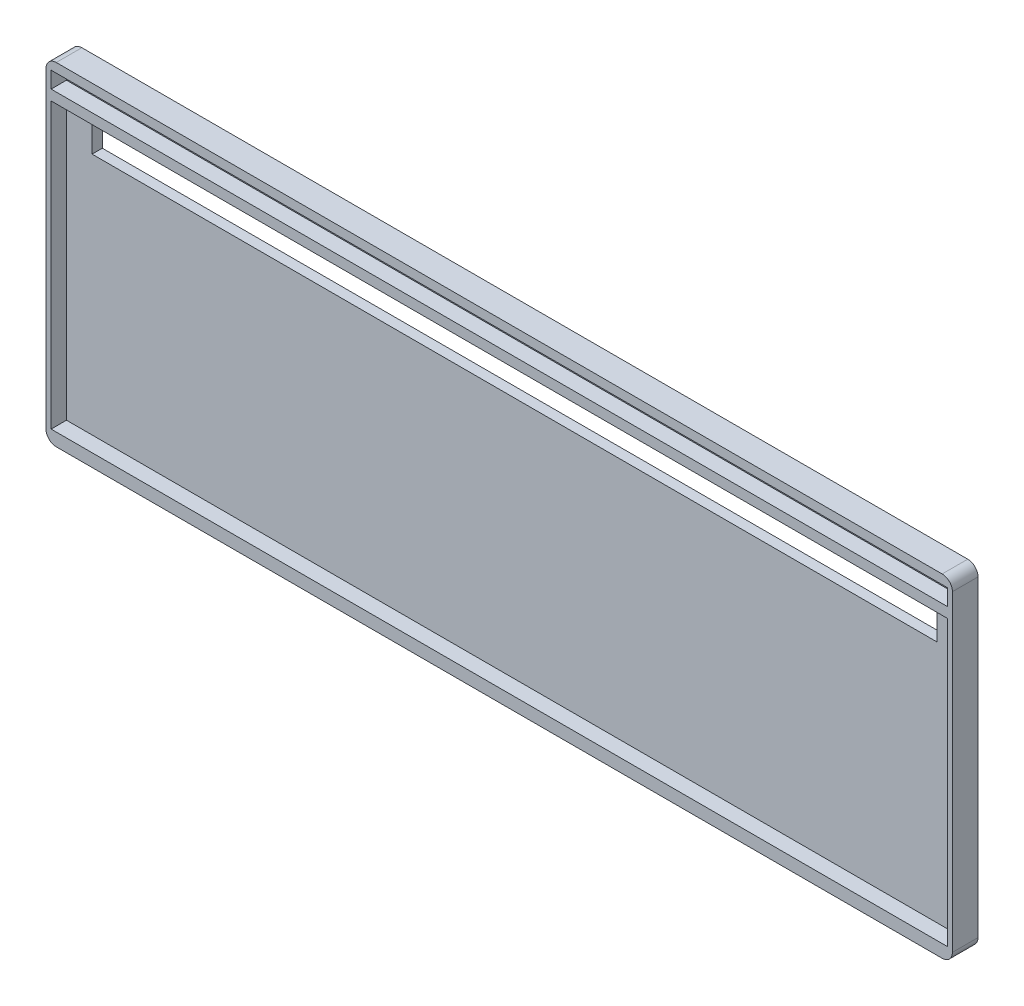
ISO-10303-21;
HEADER;
FILE_DESCRIPTION(('STEP AP214'),'2;1');
FILE_NAME('part.step','',(''),(''),'','','');
FILE_SCHEMA(('AUTOMOTIVE_DESIGN { 1 0 10303 214 1 1 1 1 }'));
ENDSEC;
DATA;
#1=APPLICATION_CONTEXT('core data for automotive mechanical design processes');
#2=APPLICATION_PROTOCOL_DEFINITION('international standard','automotive_design',2000,#1);
#3=PRODUCT_CONTEXT('',#1,'mechanical');
#4=PRODUCT('Part','Part','',(#3));
#5=PRODUCT_RELATED_PRODUCT_CATEGORY('part','',(#4));
#6=PRODUCT_DEFINITION_FORMATION('','',#4);
#7=PRODUCT_DEFINITION_CONTEXT('part definition',#1,'design');
#8=PRODUCT_DEFINITION('design','',#6,#7);
#9=PRODUCT_DEFINITION_SHAPE('','',#8);
#10=(LENGTH_UNIT() NAMED_UNIT(*) SI_UNIT(.MILLI.,.METRE.));
#11=(NAMED_UNIT(*) PLANE_ANGLE_UNIT() SI_UNIT($,.RADIAN.));
#12=(NAMED_UNIT(*) SI_UNIT($,.STERADIAN.) SOLID_ANGLE_UNIT());
#13=UNCERTAINTY_MEASURE_WITH_UNIT(LENGTH_MEASURE(1.E-05),#10,'distance_accuracy_value','');
#14=(GEOMETRIC_REPRESENTATION_CONTEXT(3) GLOBAL_UNCERTAINTY_ASSIGNED_CONTEXT((#13)) GLOBAL_UNIT_ASSIGNED_CONTEXT((#10,
#11,#12)) REPRESENTATION_CONTEXT('',''));
#15=CARTESIAN_POINT('',(0.,0.,0.));
#16=DIRECTION('',(0.,0.,1.));
#17=DIRECTION('',(1.,0.,0.));
#18=AXIS2_PLACEMENT_3D('',#15,#16,#17);
#19=CARTESIAN_POINT('',(0.,0.,5.));
#20=DIRECTION('',(0.,0.,-1.));
#21=DIRECTION('',(-1.,0.,0.));
#22=AXIS2_PLACEMENT_3D('',#19,#20,#21);
#23=PLANE('',#22);
#24=DIRECTION('',(0.,1.,0.));
#25=VECTOR('',#24,1.);
#26=CARTESIAN_POINT('',(-87.5,0.,5.));
#27=LINE('',#26,#25);
#28=CARTESIAN_POINT('',(-87.5,27.5,5.));
#29=VERTEX_POINT('',#28);
#30=CARTESIAN_POINT('',(-87.5,30.7,5.));
#31=VERTEX_POINT('',#30);
#32=EDGE_CURVE('E210',#29,#31,#27,.T.);
#33=ORIENTED_EDGE('',*,*,#32,.T.);
#34=DIRECTION('',(-1.,0.,0.));
#35=VECTOR('',#34,1.);
#36=CARTESIAN_POINT('',(0.,30.7,5.));
#37=LINE('',#36,#35);
#38=CARTESIAN_POINT('',(87.5,30.7,5.));
#39=VERTEX_POINT('',#38);
#40=EDGE_CURVE('E247',#39,#31,#37,.T.);
#41=ORIENTED_EDGE('',*,*,#40,.F.);
#42=DIRECTION('',(0.,1.,0.));
#43=VECTOR('',#42,1.);
#44=CARTESIAN_POINT('',(87.5,0.,5.));
#45=LINE('',#44,#43);
#46=CARTESIAN_POINT('',(87.5,27.5,5.));
#47=VERTEX_POINT('',#46);
#48=EDGE_CURVE('E262',#47,#39,#45,.T.);
#49=ORIENTED_EDGE('',*,*,#48,.F.);
#50=DIRECTION('',(1.,0.,0.));
#51=VECTOR('',#50,1.);
#52=CARTESIAN_POINT('',(0.,27.5,5.));
#53=LINE('',#52,#51);
#54=EDGE_CURVE('E259',#29,#47,#53,.T.);
#55=ORIENTED_EDGE('',*,*,#54,.F.);
#56=EDGE_LOOP('',(#33,#41,#49,#55));
#57=FACE_BOUND('',#56,.T.);
#58=DIRECTION('',(0.,-1.,0.));
#59=VECTOR('',#58,1.);
#60=CARTESIAN_POINT('',(-88.5,-32.5,5.));
#61=LINE('',#60,#59);
#62=CARTESIAN_POINT('',(-88.5,30.5,5.));
#63=VERTEX_POINT('',#62);
#64=CARTESIAN_POINT('',(-88.5,-30.5,5.));
#65=VERTEX_POINT('',#64);
#66=EDGE_CURVE('E281',#63,#65,#61,.T.);
#67=ORIENTED_EDGE('',*,*,#66,.T.);
#68=CARTESIAN_POINT('',(-86.5,-30.5,5.));
#69=DIRECTION('',(0.,0.,-1.));
#70=DIRECTION('',(-1.,0.,0.));
#71=AXIS2_PLACEMENT_3D('',#68,#69,#70);
#72=CIRCLE('',#71,2.);
#73=CARTESIAN_POINT('',(-86.5,-32.5,5.));
#74=VERTEX_POINT('',#73);
#75=EDGE_CURVE('E321',#65,#74,#72,.F.);
#76=ORIENTED_EDGE('',*,*,#75,.T.);
#77=DIRECTION('',(1.,0.,0.));
#78=VECTOR('',#77,1.);
#79=CARTESIAN_POINT('',(-88.5,-32.5,5.));
#80=LINE('',#79,#78);
#81=CARTESIAN_POINT('',(86.5,-32.5,5.));
#82=VERTEX_POINT('',#81);
#83=EDGE_CURVE('E284',#74,#82,#80,.T.);
#84=ORIENTED_EDGE('',*,*,#83,.T.);
#85=CARTESIAN_POINT('',(86.5,-30.5,5.));
#86=DIRECTION('',(0.,0.,-1.));
#87=DIRECTION('',(-1.,0.,0.));
#88=AXIS2_PLACEMENT_3D('',#85,#86,#87);
#89=CIRCLE('',#88,2.);
#90=CARTESIAN_POINT('',(88.5,-30.5,5.));
#91=VERTEX_POINT('',#90);
#92=EDGE_CURVE('E315',#82,#91,#89,.F.);
#93=ORIENTED_EDGE('',*,*,#92,.T.);
#94=DIRECTION('',(0.,1.,0.));
#95=VECTOR('',#94,1.);
#96=CARTESIAN_POINT('',(88.5,-32.5,5.));
#97=LINE('',#96,#95);
#98=CARTESIAN_POINT('',(88.5,30.5,5.));
#99=VERTEX_POINT('',#98);
#100=EDGE_CURVE('E274',#91,#99,#97,.T.);
#101=ORIENTED_EDGE('',*,*,#100,.T.);
#102=CARTESIAN_POINT('',(86.5,30.5,5.));
#103=DIRECTION('',(0.,0.,-1.));
#104=DIRECTION('',(-1.,0.,0.));
#105=AXIS2_PLACEMENT_3D('',#102,#103,#104);
#106=CIRCLE('',#105,2.);
#107=CARTESIAN_POINT('',(86.5,32.5,5.));
#108=VERTEX_POINT('',#107);
#109=EDGE_CURVE('E317',#99,#108,#106,.F.);
#110=ORIENTED_EDGE('',*,*,#109,.T.);
#111=DIRECTION('',(-1.,0.,0.));
#112=VECTOR('',#111,1.);
#113=CARTESIAN_POINT('',(-88.5,32.5,5.));
#114=LINE('',#113,#112);
#115=CARTESIAN_POINT('',(-86.5,32.5,5.));
#116=VERTEX_POINT('',#115);
#117=EDGE_CURVE('E277',#108,#116,#114,.T.);
#118=ORIENTED_EDGE('',*,*,#117,.T.);
#119=CARTESIAN_POINT('',(-86.5,30.5,5.));
#120=DIRECTION('',(0.,0.,-1.));
#121=DIRECTION('',(-1.,0.,0.));
#122=AXIS2_PLACEMENT_3D('',#119,#120,#121);
#123=CIRCLE('',#122,2.);
#124=EDGE_CURVE('E319',#116,#63,#123,.F.);
#125=ORIENTED_EDGE('',*,*,#124,.T.);
#126=EDGE_LOOP('',(#67,#76,#84,#93,#101,#110,#118,#125));
#127=FACE_BOUND('',#126,.T.);
#128=DIRECTION('',(1.,0.,0.));
#129=VECTOR('',#128,1.);
#130=CARTESIAN_POINT('',(0.,25.5,5.));
#131=LINE('',#130,#129);
#132=CARTESIAN_POINT('',(-87.5,25.5,5.));
#133=VERTEX_POINT('',#132);
#134=CARTESIAN_POINT('',(87.5,25.5,5.));
#135=VERTEX_POINT('',#134);
#136=EDGE_CURVE('E223',#133,#135,#131,.T.);
#137=ORIENTED_EDGE('',*,*,#136,.T.);
#138=DIRECTION('',(0.,1.,0.));
#139=VECTOR('',#138,1.);
#140=CARTESIAN_POINT('',(87.5,0.,5.));
#141=LINE('',#140,#139);
#142=CARTESIAN_POINT('',(87.5,-30.,5.));
#143=VERTEX_POINT('',#142);
#144=EDGE_CURVE('E214',#143,#135,#141,.T.);
#145=ORIENTED_EDGE('',*,*,#144,.F.);
#146=DIRECTION('',(1.,0.,0.));
#147=VECTOR('',#146,1.);
#148=CARTESIAN_POINT('',(0.,-30.,5.));
#149=LINE('',#148,#147);
#150=CARTESIAN_POINT('',(-87.5,-30.,5.));
#151=VERTEX_POINT('',#150);
#152=EDGE_CURVE('E230',#151,#143,#149,.T.);
#153=ORIENTED_EDGE('',*,*,#152,.F.);
#154=DIRECTION('',(0.,1.,0.));
#155=VECTOR('',#154,1.);
#156=CARTESIAN_POINT('',(-87.5,0.,5.));
#157=LINE('',#156,#155);
#158=EDGE_CURVE('E226',#151,#133,#157,.T.);
#159=ORIENTED_EDGE('',*,*,#158,.T.);
#160=EDGE_LOOP('',(#137,#145,#153,#159));
#161=FACE_BOUND('',#160,.T.);
#162=ADVANCED_FACE('F39',(#57,#127,#161),#23,.F.);
#163=CARTESIAN_POINT('',(88.5,-32.5,5.));
#164=DIRECTION('',(-1.,0.,0.));
#165=DIRECTION('',(0.,0.,1.));
#166=AXIS2_PLACEMENT_3D('',#163,#164,#165);
#167=PLANE('',#166);
#168=DIRECTION('',(0.,1.,0.));
#169=VECTOR('',#168,1.);
#170=CARTESIAN_POINT('',(88.5,-32.5,0.));
#171=LINE('',#170,#169);
#172=CARTESIAN_POINT('',(88.5,-30.5,0.));
#173=VERTEX_POINT('',#172);
#174=CARTESIAN_POINT('',(88.5,30.5,0.));
#175=VERTEX_POINT('',#174);
#176=EDGE_CURVE('E237',#173,#175,#171,.T.);
#177=ORIENTED_EDGE('',*,*,#176,.T.);
#178=DIRECTION('',(0.,0.,-1.));
#179=VECTOR('',#178,1.);
#180=CARTESIAN_POINT('',(88.5,30.5,5.));
#181=LINE('',#180,#179);
#182=EDGE_CURVE('E11',#175,#99,#181,.F.);
#183=ORIENTED_EDGE('',*,*,#182,.T.);
#184=ORIENTED_EDGE('',*,*,#100,.F.);
#185=DIRECTION('',(0.,0.,-1.));
#186=VECTOR('',#185,1.);
#187=CARTESIAN_POINT('',(88.5,-30.5,5.));
#188=LINE('',#187,#186);
#189=EDGE_CURVE('E47',#91,#173,#188,.T.);
#190=ORIENTED_EDGE('',*,*,#189,.T.);
#191=EDGE_LOOP('',(#177,#183,#184,#190));
#192=FACE_BOUND('',#191,.T.);
#193=ADVANCED_FACE('F332',(#192),#167,.F.);
#194=CARTESIAN_POINT('',(-88.5,32.5,5.));
#195=DIRECTION('',(0.,-1.,0.));
#196=DIRECTION('',(0.,0.,-1.));
#197=AXIS2_PLACEMENT_3D('',#194,#195,#196);
#198=PLANE('',#197);
#199=DIRECTION('',(-1.,0.,0.));
#200=VECTOR('',#199,1.);
#201=CARTESIAN_POINT('',(-88.5,32.5,0.));
#202=LINE('',#201,#200);
#203=CARTESIAN_POINT('',(86.5,32.5,0.));
#204=VERTEX_POINT('',#203);
#205=CARTESIAN_POINT('',(-86.5,32.5,0.));
#206=VERTEX_POINT('',#205);
#207=EDGE_CURVE('E290',#204,#206,#202,.T.);
#208=ORIENTED_EDGE('',*,*,#207,.T.);
#209=DIRECTION('',(0.,0.,-1.));
#210=VECTOR('',#209,1.);
#211=CARTESIAN_POINT('',(-86.5,32.5,5.));
#212=LINE('',#211,#210);
#213=EDGE_CURVE('E326',#206,#116,#212,.F.);
#214=ORIENTED_EDGE('',*,*,#213,.T.);
#215=ORIENTED_EDGE('',*,*,#117,.F.);
#216=DIRECTION('',(0.,0.,-1.));
#217=VECTOR('',#216,1.);
#218=CARTESIAN_POINT('',(86.5,32.5,5.));
#219=LINE('',#218,#217);
#220=EDGE_CURVE('E323',#108,#204,#219,.T.);
#221=ORIENTED_EDGE('',*,*,#220,.T.);
#222=EDGE_LOOP('',(#208,#214,#215,#221));
#223=FACE_BOUND('',#222,.T.);
#224=ADVANCED_FACE('F346',(#223),#198,.F.);
#225=CARTESIAN_POINT('',(-88.5,-32.5,5.));
#226=DIRECTION('',(1.,0.,0.));
#227=DIRECTION('',(0.,0.,-1.));
#228=AXIS2_PLACEMENT_3D('',#225,#226,#227);
#229=PLANE('',#228);
#230=DIRECTION('',(0.,-1.,0.));
#231=VECTOR('',#230,1.);
#232=CARTESIAN_POINT('',(-88.5,-32.5,0.));
#233=LINE('',#232,#231);
#234=CARTESIAN_POINT('',(-88.5,30.5,0.));
#235=VERTEX_POINT('',#234);
#236=CARTESIAN_POINT('',(-88.5,-30.5,0.));
#237=VERTEX_POINT('',#236);
#238=EDGE_CURVE('E293',#235,#237,#233,.T.);
#239=ORIENTED_EDGE('',*,*,#238,.T.);
#240=DIRECTION('',(0.,0.,-1.));
#241=VECTOR('',#240,1.);
#242=CARTESIAN_POINT('',(-88.5,-30.5,5.));
#243=LINE('',#242,#241);
#244=EDGE_CURVE('E313',#237,#65,#243,.F.);
#245=ORIENTED_EDGE('',*,*,#244,.T.);
#246=ORIENTED_EDGE('',*,*,#66,.F.);
#247=DIRECTION('',(0.,0.,-1.));
#248=VECTOR('',#247,1.);
#249=CARTESIAN_POINT('',(-88.5,30.5,5.));
#250=LINE('',#249,#248);
#251=EDGE_CURVE('E310',#63,#235,#250,.T.);
#252=ORIENTED_EDGE('',*,*,#251,.T.);
#253=EDGE_LOOP('',(#239,#245,#246,#252));
#254=FACE_BOUND('',#253,.T.);
#255=ADVANCED_FACE('F357',(#254),#229,.F.);
#256=CARTESIAN_POINT('',(-88.5,-32.5,5.));
#257=DIRECTION('',(0.,1.,0.));
#258=DIRECTION('',(0.,0.,1.));
#259=AXIS2_PLACEMENT_3D('',#256,#257,#258);
#260=PLANE('',#259);
#261=ORIENTED_EDGE('',*,*,#83,.F.);
#262=DIRECTION('',(0.,0.,-1.));
#263=VECTOR('',#262,1.);
#264=CARTESIAN_POINT('',(-86.5,-32.5,5.));
#265=LINE('',#264,#263);
#266=CARTESIAN_POINT('',(-86.5,-32.5,0.));
#267=VERTEX_POINT('',#266);
#268=EDGE_CURVE('E299',#74,#267,#265,.T.);
#269=ORIENTED_EDGE('',*,*,#268,.T.);
#270=DIRECTION('',(1.,0.,0.));
#271=VECTOR('',#270,1.);
#272=CARTESIAN_POINT('',(-88.5,-32.5,0.));
#273=LINE('',#272,#271);
#274=CARTESIAN_POINT('',(86.5,-32.5,0.));
#275=VERTEX_POINT('',#274);
#276=EDGE_CURVE('E278',#267,#275,#273,.T.);
#277=ORIENTED_EDGE('',*,*,#276,.T.);
#278=DIRECTION('',(0.,0.,-1.));
#279=VECTOR('',#278,1.);
#280=CARTESIAN_POINT('',(86.5,-32.5,5.));
#281=LINE('',#280,#279);
#282=EDGE_CURVE('E287',#275,#82,#281,.F.);
#283=ORIENTED_EDGE('',*,*,#282,.T.);
#284=EDGE_LOOP('',(#261,#269,#277,#283));
#285=FACE_BOUND('',#284,.T.);
#286=ADVANCED_FACE('F365',(#285),#260,.F.);
#287=CARTESIAN_POINT('',(0.,0.,0.));
#288=DIRECTION('',(0.,0.,-1.));
#289=DIRECTION('',(-1.,0.,0.));
#290=AXIS2_PLACEMENT_3D('',#287,#288,#289);
#291=PLANE('',#290);
#292=DIRECTION('',(0.,1.,0.));
#293=VECTOR('',#292,1.);
#294=CARTESIAN_POINT('',(-82.5,0.,0.));
#295=LINE('',#294,#293);
#296=CARTESIAN_POINT('',(-82.5,17.5,0.));
#297=VERTEX_POINT('',#296);
#298=CARTESIAN_POINT('',(-82.5,23.5,0.));
#299=VERTEX_POINT('',#298);
#300=EDGE_CURVE('E208',#297,#299,#295,.T.);
#301=ORIENTED_EDGE('',*,*,#300,.F.);
#302=DIRECTION('',(-1.,0.,0.));
#303=VECTOR('',#302,1.);
#304=CARTESIAN_POINT('',(0.,17.5,0.));
#305=LINE('',#304,#303);
#306=CARTESIAN_POINT('',(82.5,17.5,0.));
#307=VERTEX_POINT('',#306);
#308=EDGE_CURVE('E201',#307,#297,#305,.T.);
#309=ORIENTED_EDGE('',*,*,#308,.F.);
#310=DIRECTION('',(0.,-1.,0.));
#311=VECTOR('',#310,1.);
#312=CARTESIAN_POINT('',(82.5000000000001,1.90819582357449E-13,0.));
#313=LINE('',#312,#311);
#314=CARTESIAN_POINT('',(82.5,23.5,0.));
#315=VERTEX_POINT('',#314);
#316=EDGE_CURVE('E181',#315,#307,#313,.T.);
#317=ORIENTED_EDGE('',*,*,#316,.F.);
#318=DIRECTION('',(1.,0.,0.));
#319=VECTOR('',#318,1.);
#320=CARTESIAN_POINT('',(0.,23.5,0.));
#321=LINE('',#320,#319);
#322=EDGE_CURVE('E206',#299,#315,#321,.T.);
#323=ORIENTED_EDGE('',*,*,#322,.F.);
#324=EDGE_LOOP('',(#301,#309,#317,#323));
#325=FACE_BOUND('',#324,.T.);
#326=ORIENTED_EDGE('',*,*,#276,.F.);
#327=CARTESIAN_POINT('',(-86.5,-30.5,0.));
#328=DIRECTION('',(0.,0.,-1.));
#329=DIRECTION('',(-1.,0.,0.));
#330=AXIS2_PLACEMENT_3D('',#327,#328,#329);
#331=CIRCLE('',#330,2.);
#332=EDGE_CURVE('E308',#267,#237,#331,.T.);
#333=ORIENTED_EDGE('',*,*,#332,.T.);
#334=ORIENTED_EDGE('',*,*,#238,.F.);
#335=CARTESIAN_POINT('',(-86.5,30.5,0.));
#336=DIRECTION('',(0.,0.,-1.));
#337=DIRECTION('',(-1.,0.,0.));
#338=AXIS2_PLACEMENT_3D('',#335,#336,#337);
#339=CIRCLE('',#338,2.);
#340=EDGE_CURVE('E306',#235,#206,#339,.T.);
#341=ORIENTED_EDGE('',*,*,#340,.T.);
#342=ORIENTED_EDGE('',*,*,#207,.F.);
#343=CARTESIAN_POINT('',(86.5,30.5,0.));
#344=DIRECTION('',(0.,0.,-1.));
#345=DIRECTION('',(-1.,0.,0.));
#346=AXIS2_PLACEMENT_3D('',#343,#344,#345);
#347=CIRCLE('',#346,2.);
#348=EDGE_CURVE('E304',#204,#175,#347,.T.);
#349=ORIENTED_EDGE('',*,*,#348,.T.);
#350=ORIENTED_EDGE('',*,*,#176,.F.);
#351=CARTESIAN_POINT('',(86.5,-30.5,0.));
#352=DIRECTION('',(0.,0.,-1.));
#353=DIRECTION('',(-1.,0.,0.));
#354=AXIS2_PLACEMENT_3D('',#351,#352,#353);
#355=CIRCLE('',#354,2.);
#356=EDGE_CURVE('E302',#173,#275,#355,.T.);
#357=ORIENTED_EDGE('',*,*,#356,.T.);
#358=EDGE_LOOP('',(#326,#333,#334,#341,#342,#349,#350,#357));
#359=FACE_BOUND('',#358,.T.);
#360=ADVANCED_FACE('F338',(#325,#359),#291,.T.);
#361=CARTESIAN_POINT('',(-87.5,0.,2.));
#362=DIRECTION('',(1.,0.,0.));
#363=DIRECTION('',(0.,0.,-1.));
#364=AXIS2_PLACEMENT_3D('',#361,#362,#363);
#365=PLANE('',#364);
#366=ORIENTED_EDGE('',*,*,#32,.F.);
#367=DIRECTION('',(0.,0.,1.));
#368=VECTOR('',#367,1.);
#369=CARTESIAN_POINT('',(-87.5,27.5,2.));
#370=LINE('',#369,#368);
#371=CARTESIAN_POINT('',(-87.5,27.5,2.));
#372=VERTEX_POINT('',#371);
#373=EDGE_CURVE('E256',#372,#29,#370,.T.);
#374=ORIENTED_EDGE('',*,*,#373,.F.);
#375=DIRECTION('',(0.,1.,0.));
#376=VECTOR('',#375,1.);
#377=CARTESIAN_POINT('',(-87.5,0.,2.));
#378=LINE('',#377,#376);
#379=CARTESIAN_POINT('',(-87.5,30.7,2.));
#380=VERTEX_POINT('',#379);
#381=EDGE_CURVE('E244',#372,#380,#378,.T.);
#382=ORIENTED_EDGE('',*,*,#381,.T.);
#383=DIRECTION('',(0.,0.,1.));
#384=VECTOR('',#383,1.);
#385=CARTESIAN_POINT('',(-87.5,30.7,2.));
#386=LINE('',#385,#384);
#387=EDGE_CURVE('E227',#380,#31,#386,.T.);
#388=ORIENTED_EDGE('',*,*,#387,.T.);
#389=EDGE_LOOP('',(#366,#374,#382,#388));
#390=FACE_BOUND('',#389,.T.);
#391=ADVANCED_FACE('F386',(#390),#365,.T.);
#392=CARTESIAN_POINT('',(0.,30.7,2.));
#393=DIRECTION('',(0.,1.,0.));
#394=DIRECTION('',(-1.,0.,0.));
#395=AXIS2_PLACEMENT_3D('',#392,#393,#394);
#396=PLANE('',#395);
#397=ORIENTED_EDGE('',*,*,#40,.T.);
#398=ORIENTED_EDGE('',*,*,#387,.F.);
#399=DIRECTION('',(-1.,0.,0.));
#400=VECTOR('',#399,1.);
#401=CARTESIAN_POINT('',(0.,30.7,2.));
#402=LINE('',#401,#400);
#403=CARTESIAN_POINT('',(87.5,30.7,2.));
#404=VERTEX_POINT('',#403);
#405=EDGE_CURVE('E253',#404,#380,#402,.T.);
#406=ORIENTED_EDGE('',*,*,#405,.F.);
#407=DIRECTION('',(0.,0.,1.));
#408=VECTOR('',#407,1.);
#409=CARTESIAN_POINT('',(87.5,30.7,2.));
#410=LINE('',#409,#408);
#411=EDGE_CURVE('E268',#404,#39,#410,.T.);
#412=ORIENTED_EDGE('',*,*,#411,.T.);
#413=EDGE_LOOP('',(#397,#398,#406,#412));
#414=FACE_BOUND('',#413,.T.);
#415=ADVANCED_FACE('F470',(#414),#396,.F.);
#416=CARTESIAN_POINT('',(87.5,0.,2.));
#417=DIRECTION('',(1.,0.,0.));
#418=DIRECTION('',(0.,0.,-1.));
#419=AXIS2_PLACEMENT_3D('',#416,#417,#418);
#420=PLANE('',#419);
#421=ORIENTED_EDGE('',*,*,#48,.T.);
#422=ORIENTED_EDGE('',*,*,#411,.F.);
#423=DIRECTION('',(0.,1.,0.));
#424=VECTOR('',#423,1.);
#425=CARTESIAN_POINT('',(87.5,0.,2.));
#426=LINE('',#425,#424);
#427=CARTESIAN_POINT('',(87.5,27.5,2.));
#428=VERTEX_POINT('',#427);
#429=EDGE_CURVE('E250',#428,#404,#426,.T.);
#430=ORIENTED_EDGE('',*,*,#429,.F.);
#431=DIRECTION('',(0.,0.,1.));
#432=VECTOR('',#431,1.);
#433=CARTESIAN_POINT('',(87.5,27.5,2.));
#434=LINE('',#433,#432);
#435=EDGE_CURVE('E270',#428,#47,#434,.T.);
#436=ORIENTED_EDGE('',*,*,#435,.T.);
#437=EDGE_LOOP('',(#421,#422,#430,#436));
#438=FACE_BOUND('',#437,.T.);
#439=ADVANCED_FACE('F473',(#438),#420,.F.);
#440=CARTESIAN_POINT('',(0.,27.5,2.));
#441=DIRECTION('',(0.,-1.,0.));
#442=DIRECTION('',(0.,0.,-1.));
#443=AXIS2_PLACEMENT_3D('',#440,#441,#442);
#444=PLANE('',#443);
#445=ORIENTED_EDGE('',*,*,#54,.T.);
#446=ORIENTED_EDGE('',*,*,#435,.F.);
#447=DIRECTION('',(1.,0.,0.));
#448=VECTOR('',#447,1.);
#449=CARTESIAN_POINT('',(0.,27.5,2.));
#450=LINE('',#449,#448);
#451=EDGE_CURVE('E246',#372,#428,#450,.T.);
#452=ORIENTED_EDGE('',*,*,#451,.F.);
#453=ORIENTED_EDGE('',*,*,#373,.T.);
#454=EDGE_LOOP('',(#445,#446,#452,#453));
#455=FACE_BOUND('',#454,.T.);
#456=ADVANCED_FACE('F468',(#455),#444,.F.);
#457=CARTESIAN_POINT('',(0.,0.,2.));
#458=DIRECTION('',(0.,0.,1.));
#459=DIRECTION('',(1.,0.,0.));
#460=AXIS2_PLACEMENT_3D('',#457,#458,#459);
#461=PLANE('',#460);
#462=ORIENTED_EDGE('',*,*,#381,.F.);
#463=ORIENTED_EDGE('',*,*,#451,.T.);
#464=ORIENTED_EDGE('',*,*,#429,.T.);
#465=ORIENTED_EDGE('',*,*,#405,.T.);
#466=EDGE_LOOP('',(#462,#463,#464,#465));
#467=FACE_BOUND('',#466,.T.);
#468=ADVANCED_FACE('F464',(#467),#461,.T.);
#469=CARTESIAN_POINT('',(0.,25.5,2.));
#470=DIRECTION('',(0.,-1.,0.));
#471=DIRECTION('',(0.,0.,-1.));
#472=AXIS2_PLACEMENT_3D('',#469,#470,#471);
#473=PLANE('',#472);
#474=ORIENTED_EDGE('',*,*,#136,.F.);
#475=DIRECTION('',(0.,0.,1.));
#476=VECTOR('',#475,1.);
#477=CARTESIAN_POINT('',(-87.5,25.5,2.));
#478=LINE('',#477,#476);
#479=CARTESIAN_POINT('',(-87.5,25.5,2.));
#480=VERTEX_POINT('',#479);
#481=EDGE_CURVE('E222',#480,#133,#478,.T.);
#482=ORIENTED_EDGE('',*,*,#481,.F.);
#483=DIRECTION('',(1.,0.,0.));
#484=VECTOR('',#483,1.);
#485=CARTESIAN_POINT('',(0.,25.5,2.));
#486=LINE('',#485,#484);
#487=CARTESIAN_POINT('',(87.5,25.5,2.));
#488=VERTEX_POINT('',#487);
#489=EDGE_CURVE('E211',#480,#488,#486,.T.);
#490=ORIENTED_EDGE('',*,*,#489,.T.);
#491=DIRECTION('',(0.,0.,1.));
#492=VECTOR('',#491,1.);
#493=CARTESIAN_POINT('',(87.5,25.5,2.));
#494=LINE('',#493,#492);
#495=EDGE_CURVE('E235',#488,#135,#494,.T.);
#496=ORIENTED_EDGE('',*,*,#495,.T.);
#497=EDGE_LOOP('',(#474,#482,#490,#496));
#498=FACE_BOUND('',#497,.T.);
#499=ADVANCED_FACE('F455',(#498),#473,.T.);
#500=CARTESIAN_POINT('',(87.5,0.,2.));
#501=DIRECTION('',(1.,0.,0.));
#502=DIRECTION('',(0.,0.,-1.));
#503=AXIS2_PLACEMENT_3D('',#500,#501,#502);
#504=PLANE('',#503);
#505=ORIENTED_EDGE('',*,*,#144,.T.);
#506=ORIENTED_EDGE('',*,*,#495,.F.);
#507=DIRECTION('',(0.,1.,0.));
#508=VECTOR('',#507,1.);
#509=CARTESIAN_POINT('',(87.5,0.,2.));
#510=LINE('',#509,#508);
#511=CARTESIAN_POINT('',(87.5,-30.,2.));
#512=VERTEX_POINT('',#511);
#513=EDGE_CURVE('E219',#512,#488,#510,.T.);
#514=ORIENTED_EDGE('',*,*,#513,.F.);
#515=DIRECTION('',(0.,0.,1.));
#516=VECTOR('',#515,1.);
#517=CARTESIAN_POINT('',(87.5,-30.,2.));
#518=LINE('',#517,#516);
#519=EDGE_CURVE('E238',#512,#143,#518,.T.);
#520=ORIENTED_EDGE('',*,*,#519,.T.);
#521=EDGE_LOOP('',(#505,#506,#514,#520));
#522=FACE_BOUND('',#521,.T.);
#523=ADVANCED_FACE('F451',(#522),#504,.F.);
#524=CARTESIAN_POINT('',(0.,-30.,2.));
#525=DIRECTION('',(0.,-1.,0.));
#526=DIRECTION('',(0.,0.,-1.));
#527=AXIS2_PLACEMENT_3D('',#524,#525,#526);
#528=PLANE('',#527);
#529=ORIENTED_EDGE('',*,*,#152,.T.);
#530=ORIENTED_EDGE('',*,*,#519,.F.);
#531=DIRECTION('',(1.,0.,0.));
#532=VECTOR('',#531,1.);
#533=CARTESIAN_POINT('',(0.,-30.,2.));
#534=LINE('',#533,#532);
#535=CARTESIAN_POINT('',(-87.5,-30.,2.));
#536=VERTEX_POINT('',#535);
#537=EDGE_CURVE('E216',#536,#512,#534,.T.);
#538=ORIENTED_EDGE('',*,*,#537,.F.);
#539=DIRECTION('',(0.,0.,1.));
#540=VECTOR('',#539,1.);
#541=CARTESIAN_POINT('',(-87.5,-30.,2.));
#542=LINE('',#541,#540);
#543=EDGE_CURVE('E240',#536,#151,#542,.T.);
#544=ORIENTED_EDGE('',*,*,#543,.T.);
#545=EDGE_LOOP('',(#529,#530,#538,#544));
#546=FACE_BOUND('',#545,.T.);
#547=ADVANCED_FACE('F454',(#546),#528,.F.);
#548=CARTESIAN_POINT('',(-87.5,0.,2.));
#549=DIRECTION('',(1.,0.,0.));
#550=DIRECTION('',(0.,0.,-1.));
#551=AXIS2_PLACEMENT_3D('',#548,#549,#550);
#552=PLANE('',#551);
#553=ORIENTED_EDGE('',*,*,#158,.F.);
#554=ORIENTED_EDGE('',*,*,#543,.F.);
#555=DIRECTION('',(0.,1.,0.));
#556=VECTOR('',#555,1.);
#557=CARTESIAN_POINT('',(-87.5,0.,2.));
#558=LINE('',#557,#556);
#559=EDGE_CURVE('E213',#536,#480,#558,.T.);
#560=ORIENTED_EDGE('',*,*,#559,.T.);
#561=ORIENTED_EDGE('',*,*,#481,.T.);
#562=EDGE_LOOP('',(#553,#554,#560,#561));
#563=FACE_BOUND('',#562,.T.);
#564=ADVANCED_FACE('F450',(#563),#552,.T.);
#565=CARTESIAN_POINT('',(0.,0.,2.));
#566=DIRECTION('',(0.,0.,1.));
#567=DIRECTION('',(1.,0.,0.));
#568=AXIS2_PLACEMENT_3D('',#565,#566,#567);
#569=PLANE('',#568);
#570=DIRECTION('',(0.,-1.,0.));
#571=VECTOR('',#570,1.);
#572=CARTESIAN_POINT('',(-82.5,23.5,2.));
#573=LINE('',#572,#571);
#574=CARTESIAN_POINT('',(-82.5,23.5,2.));
#575=VERTEX_POINT('',#574);
#576=CARTESIAN_POINT('',(-82.5,17.5,2.));
#577=VERTEX_POINT('',#576);
#578=EDGE_CURVE('E62',#575,#577,#573,.T.);
#579=ORIENTED_EDGE('',*,*,#578,.F.);
#580=DIRECTION('',(-1.,0.,0.));
#581=VECTOR('',#580,1.);
#582=CARTESIAN_POINT('',(-82.5,23.5,2.));
#583=LINE('',#582,#581);
#584=CARTESIAN_POINT('',(82.5,23.5,2.));
#585=VERTEX_POINT('',#584);
#586=EDGE_CURVE('E194',#585,#575,#583,.T.);
#587=ORIENTED_EDGE('',*,*,#586,.F.);
#588=DIRECTION('',(0.,1.,0.));
#589=VECTOR('',#588,1.);
#590=CARTESIAN_POINT('',(82.5,23.5,2.));
#591=LINE('',#590,#589);
#592=CARTESIAN_POINT('',(82.5,17.5,2.));
#593=VERTEX_POINT('',#592);
#594=EDGE_CURVE('E178',#593,#585,#591,.T.);
#595=ORIENTED_EDGE('',*,*,#594,.F.);
#596=DIRECTION('',(1.,0.,0.));
#597=VECTOR('',#596,1.);
#598=CARTESIAN_POINT('',(-82.5,17.5,2.));
#599=LINE('',#598,#597);
#600=EDGE_CURVE('E187',#577,#593,#599,.T.);
#601=ORIENTED_EDGE('',*,*,#600,.F.);
#602=EDGE_LOOP('',(#579,#587,#595,#601));
#603=FACE_BOUND('',#602,.T.);
#604=ORIENTED_EDGE('',*,*,#489,.F.);
#605=ORIENTED_EDGE('',*,*,#559,.F.);
#606=ORIENTED_EDGE('',*,*,#537,.T.);
#607=ORIENTED_EDGE('',*,*,#513,.T.);
#608=EDGE_LOOP('',(#604,#605,#606,#607));
#609=FACE_BOUND('',#608,.T.);
#610=ADVANCED_FACE('F191',(#603,#609),#569,.T.);
#611=CARTESIAN_POINT('',(-86.5,-30.5,5.));
#612=DIRECTION('',(0.,0.,-1.));
#613=DIRECTION('',(-1.,0.,0.));
#614=AXIS2_PLACEMENT_3D('',#611,#612,#613);
#615=CYLINDRICAL_SURFACE('',#614,2.);
#616=ORIENTED_EDGE('',*,*,#75,.F.);
#617=ORIENTED_EDGE('',*,*,#244,.F.);
#618=ORIENTED_EDGE('',*,*,#332,.F.);
#619=ORIENTED_EDGE('',*,*,#268,.F.);
#620=EDGE_LOOP('',(#616,#617,#618,#619));
#621=FACE_BOUND('',#620,.T.);
#622=ADVANCED_FACE('F362',(#621),#615,.T.);
#623=CARTESIAN_POINT('',(-86.5,30.5,5.));
#624=DIRECTION('',(0.,0.,-1.));
#625=DIRECTION('',(-1.,0.,0.));
#626=AXIS2_PLACEMENT_3D('',#623,#624,#625);
#627=CYLINDRICAL_SURFACE('',#626,2.);
#628=ORIENTED_EDGE('',*,*,#124,.F.);
#629=ORIENTED_EDGE('',*,*,#213,.F.);
#630=ORIENTED_EDGE('',*,*,#340,.F.);
#631=ORIENTED_EDGE('',*,*,#251,.F.);
#632=EDGE_LOOP('',(#628,#629,#630,#631));
#633=FACE_BOUND('',#632,.T.);
#634=ADVANCED_FACE('F354',(#633),#627,.T.);
#635=CARTESIAN_POINT('',(86.5,30.5,5.));
#636=DIRECTION('',(0.,0.,-1.));
#637=DIRECTION('',(-1.,0.,0.));
#638=AXIS2_PLACEMENT_3D('',#635,#636,#637);
#639=CYLINDRICAL_SURFACE('',#638,2.);
#640=ORIENTED_EDGE('',*,*,#109,.F.);
#641=ORIENTED_EDGE('',*,*,#182,.F.);
#642=ORIENTED_EDGE('',*,*,#348,.F.);
#643=ORIENTED_EDGE('',*,*,#220,.F.);
#644=EDGE_LOOP('',(#640,#641,#642,#643));
#645=FACE_BOUND('',#644,.T.);
#646=ADVANCED_FACE('F343',(#645),#639,.T.);
#647=CARTESIAN_POINT('',(86.5,-30.5,5.));
#648=DIRECTION('',(0.,0.,-1.));
#649=DIRECTION('',(-1.,0.,0.));
#650=AXIS2_PLACEMENT_3D('',#647,#648,#649);
#651=CYLINDRICAL_SURFACE('',#650,2.);
#652=ORIENTED_EDGE('',*,*,#92,.F.);
#653=ORIENTED_EDGE('',*,*,#282,.F.);
#654=ORIENTED_EDGE('',*,*,#356,.F.);
#655=ORIENTED_EDGE('',*,*,#189,.F.);
#656=EDGE_LOOP('',(#652,#653,#654,#655));
#657=FACE_BOUND('',#656,.T.);
#658=ADVANCED_FACE('F41',(#657),#651,.T.);
#659=CARTESIAN_POINT('',(-82.5,23.5,-1.));
#660=DIRECTION('',(-1.,0.,0.));
#661=DIRECTION('',(0.,0.,1.));
#662=AXIS2_PLACEMENT_3D('',#659,#660,#661);
#663=PLANE('',#662);
#664=ORIENTED_EDGE('',*,*,#300,.T.);
#665=DIRECTION('',(0.,0.,1.));
#666=VECTOR('',#665,1.);
#667=CARTESIAN_POINT('',(-82.5,23.5,-1.));
#668=LINE('',#667,#666);
#669=EDGE_CURVE('E199',#299,#575,#668,.T.);
#670=ORIENTED_EDGE('',*,*,#669,.T.);
#671=ORIENTED_EDGE('',*,*,#578,.T.);
#672=DIRECTION('',(0.,0.,1.));
#673=VECTOR('',#672,1.);
#674=CARTESIAN_POINT('',(-82.5,17.5,-1.));
#675=LINE('',#674,#673);
#676=EDGE_CURVE('E184',#297,#577,#675,.T.);
#677=ORIENTED_EDGE('',*,*,#676,.F.);
#678=EDGE_LOOP('',(#664,#670,#671,#677));
#679=FACE_BOUND('',#678,.T.);
#680=ADVANCED_FACE('F368',(#679),#663,.F.);
#681=CARTESIAN_POINT('',(-82.5,23.5,-1.));
#682=DIRECTION('',(0.,1.,0.));
#683=DIRECTION('',(0.,0.,1.));
#684=AXIS2_PLACEMENT_3D('',#681,#682,#683);
#685=PLANE('',#684);
#686=ORIENTED_EDGE('',*,*,#322,.T.);
#687=DIRECTION('',(0.,0.,1.));
#688=VECTOR('',#687,1.);
#689=CARTESIAN_POINT('',(82.5,23.5,-1.));
#690=LINE('',#689,#688);
#691=EDGE_CURVE('E183',#315,#585,#690,.T.);
#692=ORIENTED_EDGE('',*,*,#691,.T.);
#693=ORIENTED_EDGE('',*,*,#586,.T.);
#694=ORIENTED_EDGE('',*,*,#669,.F.);
#695=EDGE_LOOP('',(#686,#692,#693,#694));
#696=FACE_BOUND('',#695,.T.);
#697=ADVANCED_FACE('F374',(#696),#685,.F.);
#698=CARTESIAN_POINT('',(82.5,23.5,-1.));
#699=DIRECTION('',(1.,0.,0.));
#700=DIRECTION('',(0.,1.,0.));
#701=AXIS2_PLACEMENT_3D('',#698,#699,#700);
#702=PLANE('',#701);
#703=ORIENTED_EDGE('',*,*,#316,.T.);
#704=DIRECTION('',(0.,0.,1.));
#705=VECTOR('',#704,1.);
#706=CARTESIAN_POINT('',(82.5,17.5,-1.));
#707=LINE('',#706,#705);
#708=EDGE_CURVE('E54',#307,#593,#707,.T.);
#709=ORIENTED_EDGE('',*,*,#708,.T.);
#710=ORIENTED_EDGE('',*,*,#594,.T.);
#711=ORIENTED_EDGE('',*,*,#691,.F.);
#712=EDGE_LOOP('',(#703,#709,#710,#711));
#713=FACE_BOUND('',#712,.T.);
#714=ADVANCED_FACE('F175',(#713),#702,.F.);
#715=CARTESIAN_POINT('',(-82.5,17.5,-1.));
#716=DIRECTION('',(0.,-1.,0.));
#717=DIRECTION('',(0.,0.,-1.));
#718=AXIS2_PLACEMENT_3D('',#715,#716,#717);
#719=PLANE('',#718);
#720=ORIENTED_EDGE('',*,*,#308,.T.);
#721=ORIENTED_EDGE('',*,*,#676,.T.);
#722=ORIENTED_EDGE('',*,*,#600,.T.);
#723=ORIENTED_EDGE('',*,*,#708,.F.);
#724=EDGE_LOOP('',(#720,#721,#722,#723));
#725=FACE_BOUND('',#724,.T.);
#726=ADVANCED_FACE('F188',(#725),#719,.F.);
#727=CLOSED_SHELL('',(#162,#193,#224,#255,#286,#360,#391,#415,#439,#456,#468,#499,#523,#547,
#564,#610,#622,#634,#646,#658,#680,#697,#714,#726));
#728=MANIFOLD_SOLID_BREP('B2',#727);
#729=ADVANCED_BREP_SHAPE_REPRESENTATION('',(#18,#728),#14);
#730=SHAPE_DEFINITION_REPRESENTATION(#9,#729);
ENDSEC;
END-ISO-10303-21;
